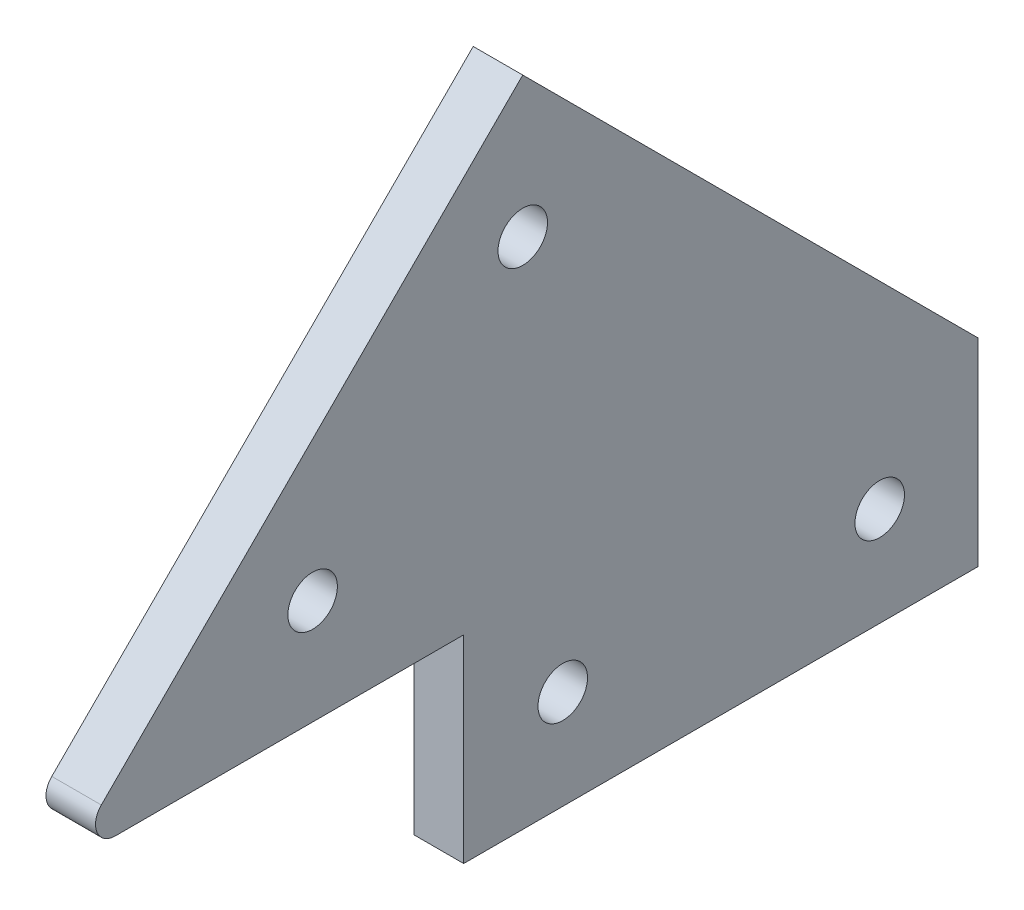
ISO-10303-21;
HEADER;
FILE_DESCRIPTION(('STEP AP214'),'2;1');
FILE_NAME('part.step','',(''),(''),'','','');
FILE_SCHEMA(('AUTOMOTIVE_DESIGN { 1 0 10303 214 1 1 1 1 }'));
ENDSEC;
DATA;
#1=APPLICATION_CONTEXT('core data for automotive mechanical design processes');
#2=APPLICATION_PROTOCOL_DEFINITION('international standard','automotive_design',2000,#1);
#3=PRODUCT_CONTEXT('',#1,'mechanical');
#4=PRODUCT('Part','Part','',(#3));
#5=PRODUCT_RELATED_PRODUCT_CATEGORY('part','',(#4));
#6=PRODUCT_DEFINITION_FORMATION('','',#4);
#7=PRODUCT_DEFINITION_CONTEXT('part definition',#1,'design');
#8=PRODUCT_DEFINITION('design','',#6,#7);
#9=PRODUCT_DEFINITION_SHAPE('','',#8);
#10=(LENGTH_UNIT() NAMED_UNIT(*) SI_UNIT(.MILLI.,.METRE.));
#11=(NAMED_UNIT(*) PLANE_ANGLE_UNIT() SI_UNIT($,.RADIAN.));
#12=(NAMED_UNIT(*) SI_UNIT($,.STERADIAN.) SOLID_ANGLE_UNIT());
#13=UNCERTAINTY_MEASURE_WITH_UNIT(LENGTH_MEASURE(1.E-05),#10,'distance_accuracy_value','');
#14=(GEOMETRIC_REPRESENTATION_CONTEXT(3) GLOBAL_UNCERTAINTY_ASSIGNED_CONTEXT((#13)) GLOBAL_UNIT_ASSIGNED_CONTEXT((#10,
#11,#12)) REPRESENTATION_CONTEXT('',''));
#15=CARTESIAN_POINT('',(0.,0.,0.));
#16=DIRECTION('',(0.,0.,1.));
#17=DIRECTION('',(1.,0.,0.));
#18=AXIS2_PLACEMENT_3D('',#15,#16,#17);
#19=CARTESIAN_POINT('',(5.,0.,165.));
#20=DIRECTION('',(0.,0.,-1.));
#21=DIRECTION('',(-1.,0.,0.));
#22=AXIS2_PLACEMENT_3D('',#19,#20,#21);
#23=PLANE('',#22);
#24=DIRECTION('',(0.,-1.,0.));
#25=VECTOR('',#24,1.);
#26=CARTESIAN_POINT('',(0.,0.,165.));
#27=LINE('',#26,#25);
#28=CARTESIAN_POINT('',(0.,0.,165.));
#29=VERTEX_POINT('',#28);
#30=CARTESIAN_POINT('',(0.,-20.,165.));
#31=VERTEX_POINT('',#30);
#32=EDGE_CURVE('E119',#29,#31,#27,.T.);
#33=ORIENTED_EDGE('',*,*,#32,.T.);
#34=DIRECTION('',(-1.,0.,0.));
#35=VECTOR('',#34,1.);
#36=CARTESIAN_POINT('',(5.,-20.,165.));
#37=LINE('',#36,#35);
#38=CARTESIAN_POINT('',(5.,-20.,165.));
#39=VERTEX_POINT('',#38);
#40=EDGE_CURVE('E101',#39,#31,#37,.T.);
#41=ORIENTED_EDGE('',*,*,#40,.F.);
#42=DIRECTION('',(0.,-1.,0.));
#43=VECTOR('',#42,1.);
#44=CARTESIAN_POINT('',(5.,0.,165.));
#45=LINE('',#44,#43);
#46=CARTESIAN_POINT('',(5.,0.,165.));
#47=VERTEX_POINT('',#46);
#48=EDGE_CURVE('E108',#47,#39,#45,.T.);
#49=ORIENTED_EDGE('',*,*,#48,.F.);
#50=DIRECTION('',(-1.,0.,0.));
#51=VECTOR('',#50,1.);
#52=CARTESIAN_POINT('',(5.,0.,165.));
#53=LINE('',#52,#51);
#54=EDGE_CURVE('E132',#47,#29,#53,.T.);
#55=ORIENTED_EDGE('',*,*,#54,.T.);
#56=EDGE_LOOP('',(#33,#41,#49,#55));
#57=FACE_BOUND('',#56,.T.);
#58=ADVANCED_FACE('F40',(#57),#23,.F.);
#59=CARTESIAN_POINT('',(5.,-20.,0.));
#60=DIRECTION('',(0.,1.,0.));
#61=DIRECTION('',(0.,0.,1.));
#62=AXIS2_PLACEMENT_3D('',#59,#60,#61);
#63=PLANE('',#62);
#64=DIRECTION('',(0.,0.,-1.));
#65=VECTOR('',#64,1.);
#66=CARTESIAN_POINT('',(0.,-20.,0.));
#67=LINE('',#66,#65);
#68=CARTESIAN_POINT('',(0.,-20.,113.076118445749));
#69=VERTEX_POINT('',#68);
#70=EDGE_CURVE('E145',#31,#69,#67,.T.);
#71=ORIENTED_EDGE('',*,*,#70,.T.);
#72=DIRECTION('',(-1.,0.,0.));
#73=VECTOR('',#72,1.);
#74=CARTESIAN_POINT('',(5.,-20.,113.076118445749));
#75=LINE('',#74,#73);
#76=CARTESIAN_POINT('',(5.,-20.,113.076118445749));
#77=VERTEX_POINT('',#76);
#78=EDGE_CURVE('E104',#77,#69,#75,.T.);
#79=ORIENTED_EDGE('',*,*,#78,.F.);
#80=DIRECTION('',(0.,0.,-1.));
#81=VECTOR('',#80,1.);
#82=CARTESIAN_POINT('',(5.,-20.,0.));
#83=LINE('',#82,#81);
#84=EDGE_CURVE('E97',#39,#77,#83,.T.);
#85=ORIENTED_EDGE('',*,*,#84,.F.);
#86=ORIENTED_EDGE('',*,*,#40,.T.);
#87=EDGE_LOOP('',(#71,#79,#85,#86));
#88=FACE_BOUND('',#87,.T.);
#89=ADVANCED_FACE('F99',(#88),#63,.F.);
#90=CARTESIAN_POINT('',(5.,0.,113.076118445749));
#91=DIRECTION('',(0.,0.,1.));
#92=DIRECTION('',(1.,0.,0.));
#93=AXIS2_PLACEMENT_3D('',#90,#91,#92);
#94=PLANE('',#93);
#95=DIRECTION('',(0.,1.,0.));
#96=VECTOR('',#95,1.);
#97=CARTESIAN_POINT('',(0.,0.,113.076118445749));
#98=LINE('',#97,#96);
#99=CARTESIAN_POINT('',(0.,0.,113.076118445749));
#100=VERTEX_POINT('',#99);
#101=EDGE_CURVE('E142',#69,#100,#98,.T.);
#102=ORIENTED_EDGE('',*,*,#101,.T.);
#103=DIRECTION('',(-1.,0.,0.));
#104=VECTOR('',#103,1.);
#105=CARTESIAN_POINT('',(5.,0.,113.076118445749));
#106=LINE('',#105,#104);
#107=CARTESIAN_POINT('',(5.,0.,113.076118445749));
#108=VERTEX_POINT('',#107);
#109=EDGE_CURVE('E124',#108,#100,#106,.T.);
#110=ORIENTED_EDGE('',*,*,#109,.F.);
#111=DIRECTION('',(0.,1.,0.));
#112=VECTOR('',#111,1.);
#113=CARTESIAN_POINT('',(5.,0.,113.076118445749));
#114=LINE('',#113,#112);
#115=EDGE_CURVE('E107',#77,#108,#114,.T.);
#116=ORIENTED_EDGE('',*,*,#115,.F.);
#117=ORIENTED_EDGE('',*,*,#78,.T.);
#118=EDGE_LOOP('',(#102,#110,#116,#117));
#119=FACE_BOUND('',#118,.T.);
#120=ADVANCED_FACE('F216',(#119),#94,.F.);
#121=CARTESIAN_POINT('',(5.,-56.5380592228744,56.5380592228743));
#122=DIRECTION('',(0.,0.707106781186548,-0.707106781186547));
#123=DIRECTION('',(0.,0.707106781186547,0.707106781186548));
#124=AXIS2_PLACEMENT_3D('',#121,#122,#123);
#125=PLANE('',#124);
#126=DIRECTION('',(0.,-0.707106781186547,-0.707106781186548));
#127=VECTOR('',#126,1.);
#128=CARTESIAN_POINT('',(0.,-56.5380592228744,56.5380592228743));
#129=LINE('',#128,#127);
#130=CARTESIAN_POINT('',(0.,45.9619407771256,159.038059222874));
#131=VERTEX_POINT('',#130);
#132=EDGE_CURVE('E139',#131,#100,#129,.T.);
#133=ORIENTED_EDGE('',*,*,#132,.F.);
#134=DIRECTION('',(-1.,0.,0.));
#135=VECTOR('',#134,1.);
#136=CARTESIAN_POINT('',(5.,45.9619407771256,159.038059222874));
#137=LINE('',#136,#135);
#138=CARTESIAN_POINT('',(5.,45.9619407771256,159.038059222874));
#139=VERTEX_POINT('',#138);
#140=EDGE_CURVE('E129',#139,#131,#137,.T.);
#141=ORIENTED_EDGE('',*,*,#140,.F.);
#142=DIRECTION('',(0.,-0.707106781186547,-0.707106781186548));
#143=VECTOR('',#142,1.);
#144=CARTESIAN_POINT('',(5.,-56.5380592228744,56.5380592228743));
#145=LINE('',#144,#143);
#146=EDGE_CURVE('E163',#139,#108,#145,.T.);
#147=ORIENTED_EDGE('',*,*,#146,.T.);
#148=ORIENTED_EDGE('',*,*,#109,.T.);
#149=EDGE_LOOP('',(#133,#141,#147,#148));
#150=FACE_BOUND('',#149,.T.);
#151=ADVANCED_FACE('F212',(#150),#125,.T.);
#152=CARTESIAN_POINT('',(5.,102.5,102.5));
#153=DIRECTION('',(0.,0.707106781186546,0.707106781186549));
#154=DIRECTION('',(0.,-0.707106781186549,0.707106781186546));
#155=AXIS2_PLACEMENT_3D('',#152,#153,#154);
#156=PLANE('',#155);
#157=DIRECTION('',(0.,0.707106781186549,-0.707106781186546));
#158=VECTOR('',#157,1.);
#159=CARTESIAN_POINT('',(0.,102.5,102.5));
#160=LINE('',#159,#158);
#161=CARTESIAN_POINT('',(0.,3.41421356237305,201.585786437627));
#162=VERTEX_POINT('',#161);
#163=EDGE_CURVE('E137',#162,#131,#160,.T.);
#164=ORIENTED_EDGE('',*,*,#163,.F.);
#165=DIRECTION('',(-1.,0.,0.));
#166=VECTOR('',#165,1.);
#167=CARTESIAN_POINT('',(5.,3.41421356237304,201.585786437627));
#168=LINE('',#167,#166);
#169=CARTESIAN_POINT('',(5.,3.41421356237305,201.585786437627));
#170=VERTEX_POINT('',#169);
#171=EDGE_CURVE('E48',#162,#170,#168,.F.);
#172=ORIENTED_EDGE('',*,*,#171,.T.);
#173=DIRECTION('',(0.,0.707106781186549,-0.707106781186546));
#174=VECTOR('',#173,1.);
#175=CARTESIAN_POINT('',(5.,102.5,102.5));
#176=LINE('',#175,#174);
#177=EDGE_CURVE('E161',#170,#139,#176,.T.);
#178=ORIENTED_EDGE('',*,*,#177,.T.);
#179=ORIENTED_EDGE('',*,*,#140,.T.);
#180=EDGE_LOOP('',(#164,#172,#178,#179));
#181=FACE_BOUND('',#180,.T.);
#182=ADVANCED_FACE('F196',(#181),#156,.T.);
#183=CARTESIAN_POINT('',(5.,10.6066017177982,180.251262658471));
#184=DIRECTION('',(-1.,0.,0.));
#185=DIRECTION('',(0.,0.,1.));
#186=AXIS2_PLACEMENT_3D('',#183,#184,#185);
#187=CYLINDRICAL_SURFACE('',#186,2.50000000000002);
#188=CARTESIAN_POINT('',(5.,10.6066017177982,180.251262658471));
#189=DIRECTION('',(1.,0.,0.));
#190=DIRECTION('',(0.,0.,-1.));
#191=AXIS2_PLACEMENT_3D('',#188,#189,#190);
#192=CIRCLE('',#191,2.50000000000002);
#193=CARTESIAN_POINT('',(5.,10.6066017177982,177.751262658471));
#194=VERTEX_POINT('',#193);
#195=EDGE_CURVE('E116',#194,#194,#192,.T.);
#196=ORIENTED_EDGE('',*,*,#195,.T.);
#197=EDGE_LOOP('',(#196));
#198=FACE_BOUND('',#197,.T.);
#199=CARTESIAN_POINT('',(0.,10.6066017177982,180.251262658471));
#200=DIRECTION('',(1.,0.,0.));
#201=DIRECTION('',(0.,0.,-1.));
#202=AXIS2_PLACEMENT_3D('',#199,#200,#201);
#203=CIRCLE('',#202,2.50000000000002);
#204=CARTESIAN_POINT('',(0.,10.6066017177982,177.751262658471));
#205=VERTEX_POINT('',#204);
#206=EDGE_CURVE('E148',#205,#205,#203,.T.);
#207=ORIENTED_EDGE('',*,*,#206,.F.);
#208=EDGE_LOOP('',(#207));
#209=FACE_BOUND('',#208,.T.);
#210=ADVANCED_FACE('F192',(#198,#209),#187,.F.);
#211=CARTESIAN_POINT('',(5.,31.8198051533947,159.038059222874));
#212=DIRECTION('',(-1.,0.,0.));
#213=DIRECTION('',(0.,0.,1.));
#214=AXIS2_PLACEMENT_3D('',#211,#212,#213);
#215=CYLINDRICAL_SURFACE('',#214,2.50000000000002);
#216=CARTESIAN_POINT('',(5.,31.8198051533947,159.038059222874));
#217=DIRECTION('',(1.,0.,0.));
#218=DIRECTION('',(0.,0.,-1.));
#219=AXIS2_PLACEMENT_3D('',#216,#217,#218);
#220=CIRCLE('',#219,2.50000000000002);
#221=CARTESIAN_POINT('',(5.,31.8198051533947,156.538059222874));
#222=VERTEX_POINT('',#221);
#223=EDGE_CURVE('E169',#222,#222,#220,.T.);
#224=ORIENTED_EDGE('',*,*,#223,.T.);
#225=EDGE_LOOP('',(#224));
#226=FACE_BOUND('',#225,.T.);
#227=CARTESIAN_POINT('',(0.,31.8198051533947,159.038059222874));
#228=DIRECTION('',(1.,0.,0.));
#229=DIRECTION('',(0.,0.,-1.));
#230=AXIS2_PLACEMENT_3D('',#227,#228,#229);
#231=CIRCLE('',#230,2.50000000000002);
#232=CARTESIAN_POINT('',(0.,31.8198051533947,156.538059222874));
#233=VERTEX_POINT('',#232);
#234=EDGE_CURVE('E151',#233,#233,#231,.T.);
#235=ORIENTED_EDGE('',*,*,#234,.F.);
#236=EDGE_LOOP('',(#235));
#237=FACE_BOUND('',#236,.T.);
#238=ADVANCED_FACE('F195',(#226,#237),#215,.F.);
#239=CARTESIAN_POINT('',(5.,-9.99999999999998,123.));
#240=DIRECTION('',(-1.,0.,0.));
#241=DIRECTION('',(0.,0.,1.));
#242=AXIS2_PLACEMENT_3D('',#239,#240,#241);
#243=CYLINDRICAL_SURFACE('',#242,2.49999999999999);
#244=CARTESIAN_POINT('',(5.,-9.99999999999998,123.));
#245=DIRECTION('',(1.,0.,0.));
#246=DIRECTION('',(0.,0.,-1.));
#247=AXIS2_PLACEMENT_3D('',#244,#245,#246);
#248=CIRCLE('',#247,2.49999999999999);
#249=CARTESIAN_POINT('',(5.,-9.99999999999998,120.5));
#250=VERTEX_POINT('',#249);
#251=EDGE_CURVE('E172',#250,#250,#248,.T.);
#252=ORIENTED_EDGE('',*,*,#251,.T.);
#253=EDGE_LOOP('',(#252));
#254=FACE_BOUND('',#253,.T.);
#255=CARTESIAN_POINT('',(0.,-9.99999999999998,123.));
#256=DIRECTION('',(1.,0.,0.));
#257=DIRECTION('',(0.,0.,-1.));
#258=AXIS2_PLACEMENT_3D('',#255,#256,#257);
#259=CIRCLE('',#258,2.49999999999999);
#260=CARTESIAN_POINT('',(0.,-9.99999999999998,120.5));
#261=VERTEX_POINT('',#260);
#262=EDGE_CURVE('E154',#261,#261,#259,.T.);
#263=ORIENTED_EDGE('',*,*,#262,.F.);
#264=EDGE_LOOP('',(#263));
#265=FACE_BOUND('',#264,.T.);
#266=ADVANCED_FACE('F232',(#254,#265),#243,.F.);
#267=CARTESIAN_POINT('',(5.,-9.99999999999998,155.));
#268=DIRECTION('',(-1.,0.,0.));
#269=DIRECTION('',(0.,0.,1.));
#270=AXIS2_PLACEMENT_3D('',#267,#268,#269);
#271=CYLINDRICAL_SURFACE('',#270,2.5);
#272=CARTESIAN_POINT('',(5.,-9.99999999999998,155.));
#273=DIRECTION('',(1.,0.,0.));
#274=DIRECTION('',(0.,0.,-1.));
#275=AXIS2_PLACEMENT_3D('',#272,#273,#274);
#276=CIRCLE('',#275,2.5);
#277=CARTESIAN_POINT('',(5.,-9.99999999999998,152.5));
#278=VERTEX_POINT('',#277);
#279=EDGE_CURVE('E136',#278,#278,#276,.T.);
#280=ORIENTED_EDGE('',*,*,#279,.T.);
#281=EDGE_LOOP('',(#280));
#282=FACE_BOUND('',#281,.T.);
#283=CARTESIAN_POINT('',(0.,-9.99999999999998,155.));
#284=DIRECTION('',(1.,0.,0.));
#285=DIRECTION('',(0.,0.,-1.));
#286=AXIS2_PLACEMENT_3D('',#283,#284,#285);
#287=CIRCLE('',#286,2.5);
#288=CARTESIAN_POINT('',(0.,-9.99999999999998,152.5));
#289=VERTEX_POINT('',#288);
#290=EDGE_CURVE('E157',#289,#289,#287,.T.);
#291=ORIENTED_EDGE('',*,*,#290,.F.);
#292=EDGE_LOOP('',(#291));
#293=FACE_BOUND('',#292,.T.);
#294=ADVANCED_FACE('F178',(#282,#293),#271,.F.);
#295=CARTESIAN_POINT('',(5.,0.,0.));
#296=DIRECTION('',(0.,-1.,0.));
#297=DIRECTION('',(0.,0.,-1.));
#298=AXIS2_PLACEMENT_3D('',#295,#296,#297);
#299=PLANE('',#298);
#300=DIRECTION('',(0.,0.,1.));
#301=VECTOR('',#300,1.);
#302=CARTESIAN_POINT('',(5.,0.,0.));
#303=LINE('',#302,#301);
#304=CARTESIAN_POINT('',(5.,0.,200.171572875254));
#305=VERTEX_POINT('',#304);
#306=EDGE_CURVE('E114',#47,#305,#303,.T.);
#307=ORIENTED_EDGE('',*,*,#306,.T.);
#308=DIRECTION('',(-1.,0.,0.));
#309=VECTOR('',#308,1.);
#310=CARTESIAN_POINT('',(5.,0.,200.171572875254));
#311=LINE('',#310,#309);
#312=CARTESIAN_POINT('',(0.,0.,200.171572875254));
#313=VERTEX_POINT('',#312);
#314=EDGE_CURVE('E120',#305,#313,#311,.T.);
#315=ORIENTED_EDGE('',*,*,#314,.T.);
#316=DIRECTION('',(0.,0.,1.));
#317=VECTOR('',#316,1.);
#318=CARTESIAN_POINT('',(0.,0.,0.));
#319=LINE('',#318,#317);
#320=EDGE_CURVE('E134',#29,#313,#319,.T.);
#321=ORIENTED_EDGE('',*,*,#320,.F.);
#322=ORIENTED_EDGE('',*,*,#54,.F.);
#323=EDGE_LOOP('',(#307,#315,#321,#322));
#324=FACE_BOUND('',#323,.T.);
#325=ADVANCED_FACE('F184',(#324),#299,.T.);
#326=CARTESIAN_POINT('',(5.,0.,0.));
#327=DIRECTION('',(1.,0.,0.));
#328=DIRECTION('',(0.,0.,-1.));
#329=AXIS2_PLACEMENT_3D('',#326,#327,#328);
#330=PLANE('',#329);
#331=ORIENTED_EDGE('',*,*,#279,.F.);
#332=EDGE_LOOP('',(#331));
#333=FACE_BOUND('',#332,.T.);
#334=ORIENTED_EDGE('',*,*,#251,.F.);
#335=EDGE_LOOP('',(#334));
#336=FACE_BOUND('',#335,.T.);
#337=ORIENTED_EDGE('',*,*,#223,.F.);
#338=EDGE_LOOP('',(#337));
#339=FACE_BOUND('',#338,.T.);
#340=ORIENTED_EDGE('',*,*,#195,.F.);
#341=EDGE_LOOP('',(#340));
#342=FACE_BOUND('',#341,.T.);
#343=ORIENTED_EDGE('',*,*,#177,.F.);
#344=CARTESIAN_POINT('',(5.,1.99999999999996,200.171572875254));
#345=DIRECTION('',(1.,0.,0.));
#346=DIRECTION('',(0.,0.,-1.));
#347=AXIS2_PLACEMENT_3D('',#344,#345,#346);
#348=CIRCLE('',#347,2.);
#349=EDGE_CURVE('E11',#170,#305,#348,.T.);
#350=ORIENTED_EDGE('',*,*,#349,.T.);
#351=ORIENTED_EDGE('',*,*,#306,.F.);
#352=ORIENTED_EDGE('',*,*,#48,.T.);
#353=ORIENTED_EDGE('',*,*,#84,.T.);
#354=ORIENTED_EDGE('',*,*,#115,.T.);
#355=ORIENTED_EDGE('',*,*,#146,.F.);
#356=EDGE_LOOP('',(#343,#350,#351,#352,#353,#354,#355));
#357=FACE_BOUND('',#356,.T.);
#358=ADVANCED_FACE('F112',(#333,#336,#339,#342,#357),#330,.T.);
#359=CARTESIAN_POINT('',(0.,0.,0.));
#360=DIRECTION('',(1.,0.,0.));
#361=DIRECTION('',(0.,0.,-1.));
#362=AXIS2_PLACEMENT_3D('',#359,#360,#361);
#363=PLANE('',#362);
#364=ORIENTED_EDGE('',*,*,#290,.T.);
#365=EDGE_LOOP('',(#364));
#366=FACE_BOUND('',#365,.T.);
#367=ORIENTED_EDGE('',*,*,#262,.T.);
#368=EDGE_LOOP('',(#367));
#369=FACE_BOUND('',#368,.T.);
#370=ORIENTED_EDGE('',*,*,#234,.T.);
#371=EDGE_LOOP('',(#370));
#372=FACE_BOUND('',#371,.T.);
#373=ORIENTED_EDGE('',*,*,#206,.T.);
#374=EDGE_LOOP('',(#373));
#375=FACE_BOUND('',#374,.T.);
#376=ORIENTED_EDGE('',*,*,#320,.T.);
#377=CARTESIAN_POINT('',(0.,1.99999999999996,200.171572875254));
#378=DIRECTION('',(1.,0.,0.));
#379=DIRECTION('',(0.,0.,-1.));
#380=AXIS2_PLACEMENT_3D('',#377,#378,#379);
#381=CIRCLE('',#380,2.);
#382=EDGE_CURVE('E62',#313,#162,#381,.F.);
#383=ORIENTED_EDGE('',*,*,#382,.T.);
#384=ORIENTED_EDGE('',*,*,#163,.T.);
#385=ORIENTED_EDGE('',*,*,#132,.T.);
#386=ORIENTED_EDGE('',*,*,#101,.F.);
#387=ORIENTED_EDGE('',*,*,#70,.F.);
#388=ORIENTED_EDGE('',*,*,#32,.F.);
#389=EDGE_LOOP('',(#376,#383,#384,#385,#386,#387,#388));
#390=FACE_BOUND('',#389,.T.);
#391=ADVANCED_FACE('F183',(#366,#369,#372,#375,#390),#363,.F.);
#392=CARTESIAN_POINT('',(5.,1.99999999999996,200.171572875254));
#393=DIRECTION('',(-1.,0.,0.));
#394=DIRECTION('',(0.,0.,1.));
#395=AXIS2_PLACEMENT_3D('',#392,#393,#394);
#396=CYLINDRICAL_SURFACE('',#395,2.);
#397=ORIENTED_EDGE('',*,*,#349,.F.);
#398=ORIENTED_EDGE('',*,*,#171,.F.);
#399=ORIENTED_EDGE('',*,*,#382,.F.);
#400=ORIENTED_EDGE('',*,*,#314,.F.);
#401=EDGE_LOOP('',(#397,#398,#399,#400));
#402=FACE_BOUND('',#401,.T.);
#403=ADVANCED_FACE('F42',(#402),#396,.T.);
#404=CLOSED_SHELL('',(#58,#89,#120,#151,#182,#210,#238,#266,#294,#325,#358,#391,#403));
#405=MANIFOLD_SOLID_BREP('B2',#404);
#406=ADVANCED_BREP_SHAPE_REPRESENTATION('',(#18,#405),#14);
#407=SHAPE_DEFINITION_REPRESENTATION(#9,#406);
ENDSEC;
END-ISO-10303-21;
